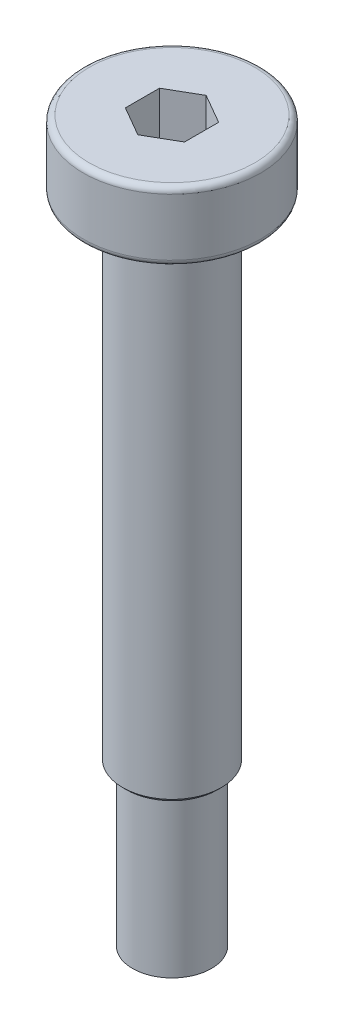
ISO-10303-21;
HEADER;
FILE_DESCRIPTION(('STEP AP214'),'2;1');
FILE_NAME('part.step','',(''),(''),'','','');
FILE_SCHEMA(('AUTOMOTIVE_DESIGN { 1 0 10303 214 1 1 1 1 }'));
ENDSEC;
DATA;
#1=APPLICATION_CONTEXT('core data for automotive mechanical design processes');
#2=APPLICATION_PROTOCOL_DEFINITION('international standard','automotive_design',2000,#1);
#3=PRODUCT_CONTEXT('',#1,'mechanical');
#4=PRODUCT('Part','Part','',(#3));
#5=PRODUCT_RELATED_PRODUCT_CATEGORY('part','',(#4));
#6=PRODUCT_DEFINITION_FORMATION('','',#4);
#7=PRODUCT_DEFINITION_CONTEXT('part definition',#1,'design');
#8=PRODUCT_DEFINITION('design','',#6,#7);
#9=PRODUCT_DEFINITION_SHAPE('','',#8);
#10=(LENGTH_UNIT() NAMED_UNIT(*) SI_UNIT(.MILLI.,.METRE.));
#11=(NAMED_UNIT(*) PLANE_ANGLE_UNIT() SI_UNIT($,.RADIAN.));
#12=(NAMED_UNIT(*) SI_UNIT($,.STERADIAN.) SOLID_ANGLE_UNIT());
#13=UNCERTAINTY_MEASURE_WITH_UNIT(LENGTH_MEASURE(1.E-05),#10,'distance_accuracy_value','');
#14=(GEOMETRIC_REPRESENTATION_CONTEXT(3) GLOBAL_UNCERTAINTY_ASSIGNED_CONTEXT((#13)) GLOBAL_UNIT_ASSIGNED_CONTEXT((#10,
#11,#12)) REPRESENTATION_CONTEXT('',''));
#15=CARTESIAN_POINT('',(0.,0.,0.));
#16=DIRECTION('',(0.,0.,1.));
#17=DIRECTION('',(1.,0.,0.));
#18=AXIS2_PLACEMENT_3D('',#15,#16,#17);
#19=CARTESIAN_POINT('',(0.,3.5,0.));
#20=DIRECTION('',(0.,1.,0.));
#21=DIRECTION('',(-1.,0.,0.));
#22=AXIS2_PLACEMENT_3D('',#19,#20,#21);
#23=PLANE('',#22);
#24=DIRECTION('',(0.866025403784439,0.,-0.5));
#25=VECTOR('',#24,1.);
#26=CARTESIAN_POINT('',(0.,3.5,1.73205080756888));
#27=LINE('',#26,#25);
#28=CARTESIAN_POINT('',(0.,3.5,1.73205080756888));
#29=VERTEX_POINT('',#28);
#30=CARTESIAN_POINT('',(1.5,3.5,0.866025403784439));
#31=VERTEX_POINT('',#30);
#32=EDGE_CURVE('E59',#29,#31,#27,.T.);
#33=ORIENTED_EDGE('',*,*,#32,.F.);
#34=DIRECTION('',(0.866025403784438,0.,0.5));
#35=VECTOR('',#34,1.);
#36=CARTESIAN_POINT('',(-1.5,3.5,0.866025403784438));
#37=LINE('',#36,#35);
#38=CARTESIAN_POINT('',(-1.5,3.5,0.866025403784438));
#39=VERTEX_POINT('',#38);
#40=EDGE_CURVE('E142',#39,#29,#37,.T.);
#41=ORIENTED_EDGE('',*,*,#40,.F.);
#42=DIRECTION('',(0.,0.,1.));
#43=VECTOR('',#42,1.);
#44=CARTESIAN_POINT('',(-1.5,3.5,-0.866025403784439));
#45=LINE('',#44,#43);
#46=CARTESIAN_POINT('',(-1.5,3.5,-0.866025403784439));
#47=VERTEX_POINT('',#46);
#48=EDGE_CURVE('E140',#47,#39,#45,.T.);
#49=ORIENTED_EDGE('',*,*,#48,.F.);
#50=DIRECTION('',(-0.866025403784439,0.,0.5));
#51=VECTOR('',#50,1.);
#52=CARTESIAN_POINT('',(0.,3.5,-1.73205080756888));
#53=LINE('',#52,#51);
#54=CARTESIAN_POINT('',(0.,3.5,-1.73205080756888));
#55=VERTEX_POINT('',#54);
#56=EDGE_CURVE('E107',#55,#47,#53,.T.);
#57=ORIENTED_EDGE('',*,*,#56,.F.);
#58=DIRECTION('',(-0.866025403784439,0.,-0.5));
#59=VECTOR('',#58,1.);
#60=CARTESIAN_POINT('',(1.5,3.5,-0.866025403784439));
#61=LINE('',#60,#59);
#62=CARTESIAN_POINT('',(1.5,3.5,-0.866025403784439));
#63=VERTEX_POINT('',#62);
#64=EDGE_CURVE('E136',#63,#55,#61,.T.);
#65=ORIENTED_EDGE('',*,*,#64,.F.);
#66=DIRECTION('',(0.,0.,-1.));
#67=VECTOR('',#66,1.);
#68=CARTESIAN_POINT('',(1.5,3.5,0.866025403784439));
#69=LINE('',#68,#67);
#70=EDGE_CURVE('E133',#31,#63,#69,.T.);
#71=ORIENTED_EDGE('',*,*,#70,.F.);
#72=EDGE_LOOP('',(#33,#41,#49,#57,#65,#71));
#73=FACE_BOUND('',#72,.T.);
#74=CARTESIAN_POINT('',(0.,3.5,0.));
#75=DIRECTION('',(0.,1.,0.));
#76=DIRECTION('',(-1.,0.,0.));
#77=AXIS2_PLACEMENT_3D('',#74,#75,#76);
#78=CIRCLE('',#77,4.2);
#79=CARTESIAN_POINT('',(-4.2,3.5,0.));
#80=VERTEX_POINT('',#79);
#81=EDGE_CURVE('E169',#80,#80,#78,.T.);
#82=ORIENTED_EDGE('',*,*,#81,.T.);
#83=EDGE_LOOP('',(#82));
#84=FACE_BOUND('',#83,.T.);
#85=ADVANCED_FACE('F43',(#73,#84),#23,.T.);
#86=CARTESIAN_POINT('',(0.,3.5,0.));
#87=DIRECTION('',(0.,1.,0.));
#88=DIRECTION('',(-1.,0.,0.));
#89=AXIS2_PLACEMENT_3D('',#86,#87,#88);
#90=CYLINDRICAL_SURFACE('',#89,4.5);
#91=CARTESIAN_POINT('',(0.,0.3,0.));
#92=DIRECTION('',(0.,-1.,0.));
#93=DIRECTION('',(1.,0.,0.));
#94=AXIS2_PLACEMENT_3D('',#91,#92,#93);
#95=CIRCLE('',#94,4.5);
#96=CARTESIAN_POINT('',(4.5,0.3,0.));
#97=VERTEX_POINT('',#96);
#98=EDGE_CURVE('E163',#97,#97,#95,.F.);
#99=ORIENTED_EDGE('',*,*,#98,.T.);
#100=EDGE_LOOP('',(#99));
#101=FACE_BOUND('',#100,.T.);
#102=CARTESIAN_POINT('',(0.,3.2,0.));
#103=DIRECTION('',(0.,1.,0.));
#104=DIRECTION('',(-1.,0.,0.));
#105=AXIS2_PLACEMENT_3D('',#102,#103,#104);
#106=CIRCLE('',#105,4.5);
#107=CARTESIAN_POINT('',(-4.5,3.2,0.));
#108=VERTEX_POINT('',#107);
#109=EDGE_CURVE('E160',#108,#108,#106,.F.);
#110=ORIENTED_EDGE('',*,*,#109,.T.);
#111=EDGE_LOOP('',(#110));
#112=FACE_BOUND('',#111,.T.);
#113=ADVANCED_FACE('F186',(#101,#112),#90,.T.);
#114=CARTESIAN_POINT('',(-4.5,0.,0.));
#115=DIRECTION('',(0.,-1.,0.));
#116=DIRECTION('',(1.,0.,0.));
#117=AXIS2_PLACEMENT_3D('',#114,#115,#116);
#118=PLANE('',#117);
#119=CARTESIAN_POINT('',(0.,0.,0.));
#120=DIRECTION('',(0.,-1.,0.));
#121=DIRECTION('',(1.,0.,0.));
#122=AXIS2_PLACEMENT_3D('',#119,#120,#121);
#123=CIRCLE('',#122,4.2);
#124=CARTESIAN_POINT('',(4.2,0.,0.));
#125=VERTEX_POINT('',#124);
#126=EDGE_CURVE('E166',#125,#125,#123,.T.);
#127=ORIENTED_EDGE('',*,*,#126,.T.);
#128=EDGE_LOOP('',(#127));
#129=FACE_BOUND('',#128,.T.);
#130=CARTESIAN_POINT('',(0.,0.,0.));
#131=DIRECTION('',(0.,1.,0.));
#132=DIRECTION('',(-1.,0.,0.));
#133=AXIS2_PLACEMENT_3D('',#130,#131,#132);
#134=CIRCLE('',#133,2.5);
#135=CARTESIAN_POINT('',(-2.5,0.,0.));
#136=VERTEX_POINT('',#135);
#137=EDGE_CURVE('E157',#136,#136,#134,.T.);
#138=ORIENTED_EDGE('',*,*,#137,.T.);
#139=EDGE_LOOP('',(#138));
#140=FACE_BOUND('',#139,.T.);
#141=ADVANCED_FACE('F192',(#129,#140),#118,.T.);
#142=CARTESIAN_POINT('',(0.,3.5,0.));
#143=DIRECTION('',(0.,1.,0.));
#144=DIRECTION('',(-1.,0.,0.));
#145=AXIS2_PLACEMENT_3D('',#142,#143,#144);
#146=CYLINDRICAL_SURFACE('',#145,2.5);
#147=CARTESIAN_POINT('',(0.,-24.8,0.));
#148=DIRECTION('',(0.,-1.,0.));
#149=DIRECTION('',(1.,0.,0.));
#150=AXIS2_PLACEMENT_3D('',#147,#148,#149);
#151=CIRCLE('',#150,2.5);
#152=CARTESIAN_POINT('',(2.5,-24.8,0.));
#153=VERTEX_POINT('',#152);
#154=EDGE_CURVE('E52',#153,#153,#151,.F.);
#155=ORIENTED_EDGE('',*,*,#154,.T.);
#156=EDGE_LOOP('',(#155));
#157=FACE_BOUND('',#156,.T.);
#158=ORIENTED_EDGE('',*,*,#137,.F.);
#159=EDGE_LOOP('',(#158));
#160=FACE_BOUND('',#159,.T.);
#161=ADVANCED_FACE('F174',(#157,#160),#146,.T.);
#162=CARTESIAN_POINT('',(-2.5,-25.,0.));
#163=DIRECTION('',(0.,-1.,0.));
#164=DIRECTION('',(1.,0.,0.));
#165=AXIS2_PLACEMENT_3D('',#162,#163,#164);
#166=PLANE('',#165);
#167=CARTESIAN_POINT('',(0.,-25.,0.));
#168=DIRECTION('',(0.,-1.,0.));
#169=DIRECTION('',(1.,0.,0.));
#170=AXIS2_PLACEMENT_3D('',#167,#168,#169);
#171=CIRCLE('',#170,2.3);
#172=CARTESIAN_POINT('',(2.3,-25.,0.));
#173=VERTEX_POINT('',#172);
#174=EDGE_CURVE('E11',#173,#173,#171,.T.);
#175=ORIENTED_EDGE('',*,*,#174,.T.);
#176=EDGE_LOOP('',(#175));
#177=FACE_BOUND('',#176,.T.);
#178=CARTESIAN_POINT('',(0.,-25.,0.));
#179=DIRECTION('',(0.,1.,0.));
#180=DIRECTION('',(-1.,0.,0.));
#181=AXIS2_PLACEMENT_3D('',#178,#179,#180);
#182=CIRCLE('',#181,1.99999999999999);
#183=CARTESIAN_POINT('',(-1.99999999999999,-25.,0.));
#184=VERTEX_POINT('',#183);
#185=EDGE_CURVE('E154',#184,#184,#182,.T.);
#186=ORIENTED_EDGE('',*,*,#185,.T.);
#187=EDGE_LOOP('',(#186));
#188=FACE_BOUND('',#187,.T.);
#189=ADVANCED_FACE('F228',(#177,#188),#166,.T.);
#190=CARTESIAN_POINT('',(0.,3.5,0.));
#191=DIRECTION('',(0.,1.,0.));
#192=DIRECTION('',(-1.,0.,0.));
#193=AXIS2_PLACEMENT_3D('',#190,#191,#192);
#194=CYLINDRICAL_SURFACE('',#193,1.99999999999999);
#195=CARTESIAN_POINT('',(0.,-33.,0.));
#196=DIRECTION('',(0.,1.,0.));
#197=DIRECTION('',(-1.,0.,0.));
#198=AXIS2_PLACEMENT_3D('',#195,#196,#197);
#199=CIRCLE('',#198,1.99999999999999);
#200=CARTESIAN_POINT('',(-1.99999999999999,-33.,0.));
#201=VERTEX_POINT('',#200);
#202=EDGE_CURVE('E146',#201,#201,#199,.T.);
#203=ORIENTED_EDGE('',*,*,#202,.T.);
#204=EDGE_LOOP('',(#203));
#205=FACE_BOUND('',#204,.T.);
#206=ORIENTED_EDGE('',*,*,#185,.F.);
#207=EDGE_LOOP('',(#206));
#208=FACE_BOUND('',#207,.T.);
#209=ADVANCED_FACE('F224',(#205,#208),#194,.T.);
#210=CARTESIAN_POINT('',(-1.99999999999999,-33.,0.));
#211=DIRECTION('',(0.,-1.,0.));
#212=DIRECTION('',(1.,0.,0.));
#213=AXIS2_PLACEMENT_3D('',#210,#211,#212);
#214=PLANE('',#213);
#215=ORIENTED_EDGE('',*,*,#202,.F.);
#216=EDGE_LOOP('',(#215));
#217=FACE_BOUND('',#216,.T.);
#218=ADVANCED_FACE('F201',(#217),#214,.T.);
#219=CARTESIAN_POINT('',(0.,0.3,0.));
#220=DIRECTION('',(0.,-1.,0.));
#221=DIRECTION('',(1.,0.,0.));
#222=AXIS2_PLACEMENT_3D('',#219,#220,#221);
#223=TOROIDAL_SURFACE('',#222,4.2,0.3);
#224=ORIENTED_EDGE('',*,*,#126,.F.);
#225=EDGE_LOOP('',(#224));
#226=FACE_BOUND('',#225,.T.);
#227=ORIENTED_EDGE('',*,*,#98,.F.);
#228=EDGE_LOOP('',(#227));
#229=FACE_BOUND('',#228,.T.);
#230=ADVANCED_FACE('F198',(#226,#229),#223,.T.);
#231=CARTESIAN_POINT('',(0.,3.2,0.));
#232=DIRECTION('',(0.,1.,0.));
#233=DIRECTION('',(-1.,0.,0.));
#234=AXIS2_PLACEMENT_3D('',#231,#232,#233);
#235=TOROIDAL_SURFACE('',#234,4.2,0.3);
#236=ORIENTED_EDGE('',*,*,#109,.F.);
#237=EDGE_LOOP('',(#236));
#238=FACE_BOUND('',#237,.T.);
#239=ORIENTED_EDGE('',*,*,#81,.F.);
#240=EDGE_LOOP('',(#239));
#241=FACE_BOUND('',#240,.T.);
#242=ADVANCED_FACE('F200',(#238,#241),#235,.T.);
#243=CARTESIAN_POINT('',(0.,1.1,1.73205080756888));
#244=DIRECTION('',(0.5,0.,0.866025403784439));
#245=DIRECTION('',(0.866025403784439,0.,-0.5));
#246=AXIS2_PLACEMENT_3D('',#243,#244,#245);
#247=PLANE('',#246);
#248=ORIENTED_EDGE('',*,*,#32,.T.);
#249=DIRECTION('',(0.,1.,0.));
#250=VECTOR('',#249,1.);
#251=CARTESIAN_POINT('',(1.5,1.1,0.866025403784439));
#252=LINE('',#251,#250);
#253=CARTESIAN_POINT('',(1.5,1.1,0.866025403784439));
#254=VERTEX_POINT('',#253);
#255=EDGE_CURVE('E89',#254,#31,#252,.T.);
#256=ORIENTED_EDGE('',*,*,#255,.F.);
#257=DIRECTION('',(0.866025403784439,0.,-0.5));
#258=VECTOR('',#257,1.);
#259=CARTESIAN_POINT('',(0.,1.1,1.73205080756888));
#260=LINE('',#259,#258);
#261=CARTESIAN_POINT('',(0.,1.1,1.73205080756888));
#262=VERTEX_POINT('',#261);
#263=EDGE_CURVE('E144',#262,#254,#260,.T.);
#264=ORIENTED_EDGE('',*,*,#263,.F.);
#265=DIRECTION('',(0.,1.,0.));
#266=VECTOR('',#265,1.);
#267=CARTESIAN_POINT('',(0.,1.1,1.73205080756888));
#268=LINE('',#267,#266);
#269=EDGE_CURVE('E67',#262,#29,#268,.T.);
#270=ORIENTED_EDGE('',*,*,#269,.T.);
#271=EDGE_LOOP('',(#248,#256,#264,#270));
#272=FACE_BOUND('',#271,.T.);
#273=ADVANCED_FACE('F204',(#272),#247,.F.);
#274=CARTESIAN_POINT('',(-1.5,1.1,0.866025403784438));
#275=DIRECTION('',(-0.5,0.,0.866025403784439));
#276=DIRECTION('',(0.866025403784439,0.,0.5));
#277=AXIS2_PLACEMENT_3D('',#274,#275,#276);
#278=PLANE('',#277);
#279=ORIENTED_EDGE('',*,*,#40,.T.);
#280=ORIENTED_EDGE('',*,*,#269,.F.);
#281=DIRECTION('',(0.866025403784438,0.,0.5));
#282=VECTOR('',#281,1.);
#283=CARTESIAN_POINT('',(-1.5,1.1,0.866025403784438));
#284=LINE('',#283,#282);
#285=CARTESIAN_POINT('',(-1.5,1.1,0.866025403784438));
#286=VERTEX_POINT('',#285);
#287=EDGE_CURVE('E119',#286,#262,#284,.T.);
#288=ORIENTED_EDGE('',*,*,#287,.F.);
#289=DIRECTION('',(0.,1.,0.));
#290=VECTOR('',#289,1.);
#291=CARTESIAN_POINT('',(-1.5,1.1,0.866025403784438));
#292=LINE('',#291,#290);
#293=EDGE_CURVE('E111',#286,#39,#292,.T.);
#294=ORIENTED_EDGE('',*,*,#293,.T.);
#295=EDGE_LOOP('',(#279,#280,#288,#294));
#296=FACE_BOUND('',#295,.T.);
#297=ADVANCED_FACE('F209',(#296),#278,.F.);
#298=CARTESIAN_POINT('',(-1.5,1.1,-0.866025403784439));
#299=DIRECTION('',(-1.,0.,0.));
#300=DIRECTION('',(0.,-1.,0.));
#301=AXIS2_PLACEMENT_3D('',#298,#299,#300);
#302=PLANE('',#301);
#303=ORIENTED_EDGE('',*,*,#48,.T.);
#304=ORIENTED_EDGE('',*,*,#293,.F.);
#305=DIRECTION('',(0.,0.,1.));
#306=VECTOR('',#305,1.);
#307=CARTESIAN_POINT('',(-1.5,1.1,-0.866025403784439));
#308=LINE('',#307,#306);
#309=CARTESIAN_POINT('',(-1.5,1.1,-0.866025403784439));
#310=VERTEX_POINT('',#309);
#311=EDGE_CURVE('E115',#310,#286,#308,.T.);
#312=ORIENTED_EDGE('',*,*,#311,.F.);
#313=DIRECTION('',(0.,1.,0.));
#314=VECTOR('',#313,1.);
#315=CARTESIAN_POINT('',(-1.5,1.1,-0.866025403784439));
#316=LINE('',#315,#314);
#317=EDGE_CURVE('E100',#310,#47,#316,.T.);
#318=ORIENTED_EDGE('',*,*,#317,.T.);
#319=EDGE_LOOP('',(#303,#304,#312,#318));
#320=FACE_BOUND('',#319,.T.);
#321=ADVANCED_FACE('F116',(#320),#302,.F.);
#322=CARTESIAN_POINT('',(0.,1.1,-1.73205080756888));
#323=DIRECTION('',(-0.5,0.,-0.866025403784439));
#324=DIRECTION('',(-0.866025403784439,0.,0.5));
#325=AXIS2_PLACEMENT_3D('',#322,#323,#324);
#326=PLANE('',#325);
#327=ORIENTED_EDGE('',*,*,#56,.T.);
#328=ORIENTED_EDGE('',*,*,#317,.F.);
#329=DIRECTION('',(-0.866025403784439,0.,0.5));
#330=VECTOR('',#329,1.);
#331=CARTESIAN_POINT('',(0.,1.1,-1.73205080756888));
#332=LINE('',#331,#330);
#333=CARTESIAN_POINT('',(0.,1.1,-1.73205080756888));
#334=VERTEX_POINT('',#333);
#335=EDGE_CURVE('E104',#334,#310,#332,.T.);
#336=ORIENTED_EDGE('',*,*,#335,.F.);
#337=DIRECTION('',(0.,1.,0.));
#338=VECTOR('',#337,1.);
#339=CARTESIAN_POINT('',(0.,1.1,-1.73205080756888));
#340=LINE('',#339,#338);
#341=EDGE_CURVE('E112',#334,#55,#340,.T.);
#342=ORIENTED_EDGE('',*,*,#341,.T.);
#343=EDGE_LOOP('',(#327,#328,#336,#342));
#344=FACE_BOUND('',#343,.T.);
#345=ADVANCED_FACE('F102',(#344),#326,.F.);
#346=CARTESIAN_POINT('',(1.5,1.1,-0.866025403784439));
#347=DIRECTION('',(0.5,0.,-0.866025403784439));
#348=DIRECTION('',(-0.866025403784439,0.,-0.5));
#349=AXIS2_PLACEMENT_3D('',#346,#347,#348);
#350=PLANE('',#349);
#351=ORIENTED_EDGE('',*,*,#64,.T.);
#352=ORIENTED_EDGE('',*,*,#341,.F.);
#353=DIRECTION('',(-0.866025403784439,0.,-0.5));
#354=VECTOR('',#353,1.);
#355=CARTESIAN_POINT('',(1.5,1.1,-0.866025403784439));
#356=LINE('',#355,#354);
#357=CARTESIAN_POINT('',(1.5,1.1,-0.866025403784439));
#358=VERTEX_POINT('',#357);
#359=EDGE_CURVE('E125',#358,#334,#356,.T.);
#360=ORIENTED_EDGE('',*,*,#359,.F.);
#361=DIRECTION('',(0.,1.,0.));
#362=VECTOR('',#361,1.);
#363=CARTESIAN_POINT('',(1.5,1.1,-0.866025403784439));
#364=LINE('',#363,#362);
#365=EDGE_CURVE('E149',#358,#63,#364,.T.);
#366=ORIENTED_EDGE('',*,*,#365,.T.);
#367=EDGE_LOOP('',(#351,#352,#360,#366));
#368=FACE_BOUND('',#367,.T.);
#369=ADVANCED_FACE('F308',(#368),#350,.F.);
#370=CARTESIAN_POINT('',(1.5,1.1,0.866025403784439));
#371=DIRECTION('',(1.,0.,0.));
#372=DIRECTION('',(0.,1.,0.));
#373=AXIS2_PLACEMENT_3D('',#370,#371,#372);
#374=PLANE('',#373);
#375=ORIENTED_EDGE('',*,*,#70,.T.);
#376=ORIENTED_EDGE('',*,*,#365,.F.);
#377=DIRECTION('',(0.,0.,-1.));
#378=VECTOR('',#377,1.);
#379=CARTESIAN_POINT('',(1.5,1.1,0.866025403784439));
#380=LINE('',#379,#378);
#381=EDGE_CURVE('E127',#254,#358,#380,.T.);
#382=ORIENTED_EDGE('',*,*,#381,.F.);
#383=ORIENTED_EDGE('',*,*,#255,.T.);
#384=EDGE_LOOP('',(#375,#376,#382,#383));
#385=FACE_BOUND('',#384,.T.);
#386=ADVANCED_FACE('F182',(#385),#374,.F.);
#387=CARTESIAN_POINT('',(0.,1.1,0.));
#388=DIRECTION('',(0.,1.,0.));
#389=DIRECTION('',(0.,0.,1.));
#390=AXIS2_PLACEMENT_3D('',#387,#388,#389);
#391=PLANE('',#390);
#392=ORIENTED_EDGE('',*,*,#263,.T.);
#393=ORIENTED_EDGE('',*,*,#381,.T.);
#394=ORIENTED_EDGE('',*,*,#359,.T.);
#395=ORIENTED_EDGE('',*,*,#335,.T.);
#396=ORIENTED_EDGE('',*,*,#311,.T.);
#397=ORIENTED_EDGE('',*,*,#287,.T.);
#398=EDGE_LOOP('',(#392,#393,#394,#395,#396,#397));
#399=FACE_BOUND('',#398,.T.);
#400=ADVANCED_FACE('F122',(#399),#391,.T.);
#401=CARTESIAN_POINT('',(0.,-24.8,0.));
#402=DIRECTION('',(0.,1.,0.));
#403=DIRECTION('',(-1.,0.,0.));
#404=AXIS2_PLACEMENT_3D('',#401,#402,#403);
#405=CONICAL_SURFACE('',#404,2.5,0.785398163397445);
#406=ORIENTED_EDGE('',*,*,#174,.F.);
#407=EDGE_LOOP('',(#406));
#408=FACE_BOUND('',#407,.T.);
#409=ORIENTED_EDGE('',*,*,#154,.F.);
#410=EDGE_LOOP('',(#409));
#411=FACE_BOUND('',#410,.T.);
#412=ADVANCED_FACE('F46',(#408,#411),#405,.T.);
#413=CLOSED_SHELL('',(#85,#113,#141,#161,#189,#209,#218,#230,#242,#273,#297,#321,#345,#369,#386,
#400,#412));
#414=MANIFOLD_SOLID_BREP('B2',#413);
#415=ADVANCED_BREP_SHAPE_REPRESENTATION('',(#18,#414),#14);
#416=SHAPE_DEFINITION_REPRESENTATION(#9,#415);
ENDSEC;
END-ISO-10303-21;
